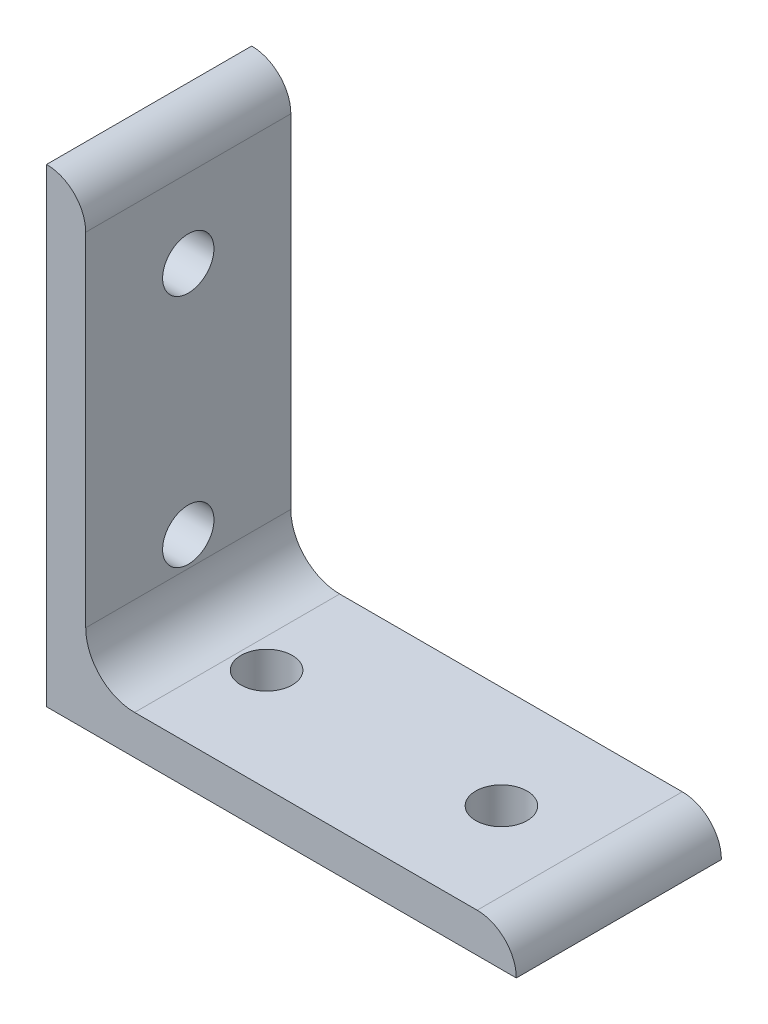
ISO-10303-21;
HEADER;
FILE_DESCRIPTION(('STEP AP214'),'2;1');
FILE_NAME('part.step','',(''),(''),'','','');
FILE_SCHEMA(('AUTOMOTIVE_DESIGN { 1 0 10303 214 1 1 1 1 }'));
ENDSEC;
DATA;
#1=APPLICATION_CONTEXT('core data for automotive mechanical design processes');
#2=APPLICATION_PROTOCOL_DEFINITION('international standard','automotive_design',2000,#1);
#3=PRODUCT_CONTEXT('',#1,'mechanical');
#4=PRODUCT('Part','Part','',(#3));
#5=PRODUCT_RELATED_PRODUCT_CATEGORY('part','',(#4));
#6=PRODUCT_DEFINITION_FORMATION('','',#4);
#7=PRODUCT_DEFINITION_CONTEXT('part definition',#1,'design');
#8=PRODUCT_DEFINITION('design','',#6,#7);
#9=PRODUCT_DEFINITION_SHAPE('','',#8);
#10=(LENGTH_UNIT() NAMED_UNIT(*) SI_UNIT(.MILLI.,.METRE.));
#11=(NAMED_UNIT(*) PLANE_ANGLE_UNIT() SI_UNIT($,.RADIAN.));
#12=(NAMED_UNIT(*) SI_UNIT($,.STERADIAN.) SOLID_ANGLE_UNIT());
#13=UNCERTAINTY_MEASURE_WITH_UNIT(LENGTH_MEASURE(1.E-05),#10,'distance_accuracy_value','');
#14=(GEOMETRIC_REPRESENTATION_CONTEXT(3) GLOBAL_UNCERTAINTY_ASSIGNED_CONTEXT((#13)) GLOBAL_UNIT_ASSIGNED_CONTEXT((#10,
#11,#12)) REPRESENTATION_CONTEXT('',''));
#15=CARTESIAN_POINT('',(0.,0.,0.));
#16=DIRECTION('',(0.,0.,1.));
#17=DIRECTION('',(1.,0.,0.));
#18=AXIS2_PLACEMENT_3D('',#15,#16,#17);
#19=CARTESIAN_POINT('',(6.35,69.85,16.637));
#20=DIRECTION('',(-1.,0.,0.));
#21=DIRECTION('',(0.,-1.,0.));
#22=AXIS2_PLACEMENT_3D('',#19,#20,#21);
#23=PLANE('',#22);
#24=DIRECTION('',(0.,1.,0.));
#25=VECTOR('',#24,1.);
#26=CARTESIAN_POINT('',(6.35,69.85,-16.637));
#27=LINE('',#26,#25);
#28=CARTESIAN_POINT('',(6.35,14.2748,-16.637));
#29=VERTEX_POINT('',#28);
#30=CARTESIAN_POINT('',(6.35,69.85,-16.637));
#31=VERTEX_POINT('',#30);
#32=EDGE_CURVE('E117',#29,#31,#27,.T.);
#33=ORIENTED_EDGE('',*,*,#32,.T.);
#34=DIRECTION('',(0.,0.,-1.));
#35=VECTOR('',#34,1.);
#36=CARTESIAN_POINT('',(6.35,69.85,16.637));
#37=LINE('',#36,#35);
#38=CARTESIAN_POINT('',(6.35,69.85,16.637));
#39=VERTEX_POINT('',#38);
#40=EDGE_CURVE('E114',#39,#31,#37,.T.);
#41=ORIENTED_EDGE('',*,*,#40,.F.);
#42=DIRECTION('',(0.,1.,0.));
#43=VECTOR('',#42,1.);
#44=CARTESIAN_POINT('',(6.35,69.85,16.637));
#45=LINE('',#44,#43);
#46=CARTESIAN_POINT('',(6.35,14.2748,16.637));
#47=VERTEX_POINT('',#46);
#48=EDGE_CURVE('E103',#47,#39,#45,.T.);
#49=ORIENTED_EDGE('',*,*,#48,.F.);
#50=DIRECTION('',(0.,0.,-1.));
#51=VECTOR('',#50,1.);
#52=CARTESIAN_POINT('',(6.35,14.2748,16.637));
#53=LINE('',#52,#51);
#54=EDGE_CURVE('E118',#47,#29,#53,.T.);
#55=ORIENTED_EDGE('',*,*,#54,.T.);
#56=EDGE_LOOP('',(#33,#41,#49,#55));
#57=FACE_BOUND('',#56,.T.);
#58=CARTESIAN_POINT('',(6.34999999999999,19.05,0.));
#59=DIRECTION('',(-1.,0.,0.));
#60=DIRECTION('',(0.,-1.,0.));
#61=AXIS2_PLACEMENT_3D('',#58,#59,#60);
#62=CIRCLE('',#61,4.1656);
#63=CARTESIAN_POINT('',(6.35,14.8844,0.));
#64=VERTEX_POINT('',#63);
#65=EDGE_CURVE('E196',#64,#64,#62,.F.);
#66=ORIENTED_EDGE('',*,*,#65,.F.);
#67=EDGE_LOOP('',(#66));
#68=FACE_BOUND('',#67,.T.);
#69=CARTESIAN_POINT('',(6.34999999999999,57.15,0.));
#70=DIRECTION('',(-1.,0.,0.));
#71=DIRECTION('',(0.,-1.,0.));
#72=AXIS2_PLACEMENT_3D('',#69,#70,#71);
#73=CIRCLE('',#72,4.1656);
#74=CARTESIAN_POINT('',(6.35,52.9844,0.));
#75=VERTEX_POINT('',#74);
#76=EDGE_CURVE('E191',#75,#75,#73,.F.);
#77=ORIENTED_EDGE('',*,*,#76,.F.);
#78=EDGE_LOOP('',(#77));
#79=FACE_BOUND('',#78,.T.);
#80=ADVANCED_FACE('F34',(#57,#68,#79),#23,.F.);
#81=CARTESIAN_POINT('',(0.,0.,16.637));
#82=DIRECTION('',(1.,0.,0.));
#83=DIRECTION('',(0.,0.,-1.));
#84=AXIS2_PLACEMENT_3D('',#81,#82,#83);
#85=PLANE('',#84);
#86=DIRECTION('',(0.,-1.,0.));
#87=VECTOR('',#86,1.);
#88=CARTESIAN_POINT('',(0.,0.,-16.637));
#89=LINE('',#88,#87);
#90=CARTESIAN_POINT('',(0.,76.2,-16.637));
#91=VERTEX_POINT('',#90);
#92=CARTESIAN_POINT('',(0.,0.,-16.637));
#93=VERTEX_POINT('',#92);
#94=EDGE_CURVE('E85',#91,#93,#89,.T.);
#95=ORIENTED_EDGE('',*,*,#94,.T.);
#96=DIRECTION('',(0.,0.,-1.));
#97=VECTOR('',#96,1.);
#98=CARTESIAN_POINT('',(0.,0.,16.637));
#99=LINE('',#98,#97);
#100=CARTESIAN_POINT('',(0.,0.,16.637));
#101=VERTEX_POINT('',#100);
#102=EDGE_CURVE('E123',#101,#93,#99,.T.);
#103=ORIENTED_EDGE('',*,*,#102,.F.);
#104=DIRECTION('',(0.,-1.,0.));
#105=VECTOR('',#104,1.);
#106=CARTESIAN_POINT('',(0.,0.,16.637));
#107=LINE('',#106,#105);
#108=CARTESIAN_POINT('',(0.,76.2,16.637));
#109=VERTEX_POINT('',#108);
#110=EDGE_CURVE('E53',#109,#101,#107,.T.);
#111=ORIENTED_EDGE('',*,*,#110,.F.);
#112=DIRECTION('',(0.,0.,-1.));
#113=VECTOR('',#112,1.);
#114=CARTESIAN_POINT('',(0.,76.2,16.637));
#115=LINE('',#114,#113);
#116=EDGE_CURVE('E119',#109,#91,#115,.T.);
#117=ORIENTED_EDGE('',*,*,#116,.T.);
#118=EDGE_LOOP('',(#95,#103,#111,#117));
#119=FACE_BOUND('',#118,.T.);
#120=CARTESIAN_POINT('',(0.,19.05,0.));
#121=DIRECTION('',(1.,0.,0.));
#122=DIRECTION('',(0.,0.,-1.));
#123=AXIS2_PLACEMENT_3D('',#120,#121,#122);
#124=CIRCLE('',#123,4.1656);
#125=CARTESIAN_POINT('',(0.,19.05,-4.1656));
#126=VERTEX_POINT('',#125);
#127=EDGE_CURVE('E186',#126,#126,#124,.T.);
#128=ORIENTED_EDGE('',*,*,#127,.T.);
#129=EDGE_LOOP('',(#128));
#130=FACE_BOUND('',#129,.T.);
#131=CARTESIAN_POINT('',(0.,57.15,0.));
#132=DIRECTION('',(1.,0.,0.));
#133=DIRECTION('',(0.,0.,-1.));
#134=AXIS2_PLACEMENT_3D('',#131,#132,#133);
#135=CIRCLE('',#134,4.1656);
#136=CARTESIAN_POINT('',(0.,57.15,-4.1656));
#137=VERTEX_POINT('',#136);
#138=EDGE_CURVE('E189',#137,#137,#135,.T.);
#139=ORIENTED_EDGE('',*,*,#138,.T.);
#140=EDGE_LOOP('',(#139));
#141=FACE_BOUND('',#140,.T.);
#142=ADVANCED_FACE('F179',(#119,#130,#141),#85,.F.);
#143=CARTESIAN_POINT('',(76.2,0.,16.637));
#144=DIRECTION('',(0.,1.,0.));
#145=DIRECTION('',(-1.,0.,0.));
#146=AXIS2_PLACEMENT_3D('',#143,#144,#145);
#147=PLANE('',#146);
#148=DIRECTION('',(1.,0.,0.));
#149=VECTOR('',#148,1.);
#150=CARTESIAN_POINT('',(76.2,0.,-16.637));
#151=LINE('',#150,#149);
#152=CARTESIAN_POINT('',(76.2,0.,-16.637));
#153=VERTEX_POINT('',#152);
#154=EDGE_CURVE('E127',#93,#153,#151,.T.);
#155=ORIENTED_EDGE('',*,*,#154,.T.);
#156=DIRECTION('',(0.,0.,-1.));
#157=VECTOR('',#156,1.);
#158=CARTESIAN_POINT('',(76.2,0.,16.637));
#159=LINE('',#158,#157);
#160=CARTESIAN_POINT('',(76.2,0.,16.637));
#161=VERTEX_POINT('',#160);
#162=EDGE_CURVE('E11',#161,#153,#159,.T.);
#163=ORIENTED_EDGE('',*,*,#162,.F.);
#164=DIRECTION('',(1.,0.,0.));
#165=VECTOR('',#164,1.);
#166=CARTESIAN_POINT('',(76.2,0.,16.637));
#167=LINE('',#166,#165);
#168=EDGE_CURVE('E140',#101,#161,#167,.T.);
#169=ORIENTED_EDGE('',*,*,#168,.F.);
#170=ORIENTED_EDGE('',*,*,#102,.T.);
#171=EDGE_LOOP('',(#155,#163,#169,#170));
#172=FACE_BOUND('',#171,.T.);
#173=CARTESIAN_POINT('',(19.05,0.,0.));
#174=DIRECTION('',(0.,1.,0.));
#175=DIRECTION('',(0.,0.,1.));
#176=AXIS2_PLACEMENT_3D('',#173,#174,#175);
#177=CIRCLE('',#176,4.1656);
#178=CARTESIAN_POINT('',(19.05,0.,-4.1656));
#179=VERTEX_POINT('',#178);
#180=EDGE_CURVE('E149',#179,#179,#177,.T.);
#181=ORIENTED_EDGE('',*,*,#180,.T.);
#182=EDGE_LOOP('',(#181));
#183=FACE_BOUND('',#182,.T.);
#184=CARTESIAN_POINT('',(57.15,0.,0.));
#185=DIRECTION('',(0.,1.,0.));
#186=DIRECTION('',(0.,0.,1.));
#187=AXIS2_PLACEMENT_3D('',#184,#185,#186);
#188=CIRCLE('',#187,4.1656);
#189=CARTESIAN_POINT('',(57.15,0.,-4.1656));
#190=VERTEX_POINT('',#189);
#191=EDGE_CURVE('E157',#190,#190,#188,.T.);
#192=ORIENTED_EDGE('',*,*,#191,.T.);
#193=EDGE_LOOP('',(#192));
#194=FACE_BOUND('',#193,.T.);
#195=ADVANCED_FACE('F36',(#172,#183,#194),#147,.F.);
#196=CARTESIAN_POINT('',(14.2748,6.35,16.637));
#197=DIRECTION('',(0.,-1.,0.));
#198=DIRECTION('',(1.,0.,0.));
#199=AXIS2_PLACEMENT_3D('',#196,#197,#198);
#200=PLANE('',#199);
#201=DIRECTION('',(-1.,0.,0.));
#202=VECTOR('',#201,1.);
#203=CARTESIAN_POINT('',(14.2748,6.35,-16.637));
#204=LINE('',#203,#202);
#205=CARTESIAN_POINT('',(69.85,6.35,-16.637));
#206=VERTEX_POINT('',#205);
#207=CARTESIAN_POINT('',(14.2748,6.35,-16.637));
#208=VERTEX_POINT('',#207);
#209=EDGE_CURVE('E133',#206,#208,#204,.T.);
#210=ORIENTED_EDGE('',*,*,#209,.T.);
#211=DIRECTION('',(0.,0.,-1.));
#212=VECTOR('',#211,1.);
#213=CARTESIAN_POINT('',(14.2748,6.35,16.637));
#214=LINE('',#213,#212);
#215=CARTESIAN_POINT('',(14.2748,6.35,16.637));
#216=VERTEX_POINT('',#215);
#217=EDGE_CURVE('E144',#216,#208,#214,.T.);
#218=ORIENTED_EDGE('',*,*,#217,.F.);
#219=DIRECTION('',(-1.,0.,0.));
#220=VECTOR('',#219,1.);
#221=CARTESIAN_POINT('',(14.2748,6.35,16.637));
#222=LINE('',#221,#220);
#223=CARTESIAN_POINT('',(69.85,6.35,16.637));
#224=VERTEX_POINT('',#223);
#225=EDGE_CURVE('E163',#224,#216,#222,.T.);
#226=ORIENTED_EDGE('',*,*,#225,.F.);
#227=DIRECTION('',(0.,0.,-1.));
#228=VECTOR('',#227,1.);
#229=CARTESIAN_POINT('',(69.85,6.35,16.637));
#230=LINE('',#229,#228);
#231=EDGE_CURVE('E44',#224,#206,#230,.T.);
#232=ORIENTED_EDGE('',*,*,#231,.T.);
#233=EDGE_LOOP('',(#210,#218,#226,#232));
#234=FACE_BOUND('',#233,.T.);
#235=CARTESIAN_POINT('',(19.05,6.35000000000001,0.));
#236=DIRECTION('',(0.,-1.,0.));
#237=DIRECTION('',(1.,0.,0.));
#238=AXIS2_PLACEMENT_3D('',#235,#236,#237);
#239=CIRCLE('',#238,4.1656);
#240=CARTESIAN_POINT('',(19.05,6.35000000000002,-4.1656));
#241=VERTEX_POINT('',#240);
#242=EDGE_CURVE('E131',#241,#241,#239,.F.);
#243=ORIENTED_EDGE('',*,*,#242,.F.);
#244=EDGE_LOOP('',(#243));
#245=FACE_BOUND('',#244,.T.);
#246=CARTESIAN_POINT('',(57.15,6.35000000000001,0.));
#247=DIRECTION('',(0.,-1.,0.));
#248=DIRECTION('',(1.,0.,0.));
#249=AXIS2_PLACEMENT_3D('',#246,#247,#248);
#250=CIRCLE('',#249,4.1656);
#251=CARTESIAN_POINT('',(57.15,6.35000000000002,-4.1656));
#252=VERTEX_POINT('',#251);
#253=EDGE_CURVE('E38',#252,#252,#250,.F.);
#254=ORIENTED_EDGE('',*,*,#253,.F.);
#255=EDGE_LOOP('',(#254));
#256=FACE_BOUND('',#255,.T.);
#257=ADVANCED_FACE('F167',(#234,#245,#256),#200,.F.);
#258=CARTESIAN_POINT('',(69.85,0.,16.637));
#259=DIRECTION('',(0.,0.,-1.));
#260=DIRECTION('',(-1.,0.,0.));
#261=AXIS2_PLACEMENT_3D('',#258,#259,#260);
#262=CYLINDRICAL_SURFACE('',#261,6.35000000000001);
#263=CARTESIAN_POINT('',(69.85,0.,-16.637));
#264=DIRECTION('',(0.,0.,1.));
#265=DIRECTION('',(1.,0.,0.));
#266=AXIS2_PLACEMENT_3D('',#263,#264,#265);
#267=CIRCLE('',#266,6.35000000000001);
#268=EDGE_CURVE('E130',#153,#206,#267,.T.);
#269=ORIENTED_EDGE('',*,*,#268,.T.);
#270=ORIENTED_EDGE('',*,*,#231,.F.);
#271=CARTESIAN_POINT('',(69.85,0.,16.637));
#272=DIRECTION('',(0.,0.,1.));
#273=DIRECTION('',(1.,0.,0.));
#274=AXIS2_PLACEMENT_3D('',#271,#272,#273);
#275=CIRCLE('',#274,6.35000000000001);
#276=EDGE_CURVE('E93',#161,#224,#275,.T.);
#277=ORIENTED_EDGE('',*,*,#276,.F.);
#278=ORIENTED_EDGE('',*,*,#162,.T.);
#279=EDGE_LOOP('',(#269,#270,#277,#278));
#280=FACE_BOUND('',#279,.T.);
#281=ADVANCED_FACE('F213',(#280),#262,.T.);
#282=CARTESIAN_POINT('',(14.2748,14.2748,16.637));
#283=DIRECTION('',(0.,0.,-1.));
#284=DIRECTION('',(-1.,0.,0.));
#285=AXIS2_PLACEMENT_3D('',#282,#283,#284);
#286=CYLINDRICAL_SURFACE('',#285,7.9248);
#287=CARTESIAN_POINT('',(14.2748,14.2748,-16.637));
#288=DIRECTION('',(0.,0.,-1.));
#289=DIRECTION('',(1.,0.,0.));
#290=AXIS2_PLACEMENT_3D('',#287,#288,#289);
#291=CIRCLE('',#290,7.9248);
#292=EDGE_CURVE('E135',#208,#29,#291,.T.);
#293=ORIENTED_EDGE('',*,*,#292,.T.);
#294=ORIENTED_EDGE('',*,*,#54,.F.);
#295=CARTESIAN_POINT('',(14.2748,14.2748,16.637));
#296=DIRECTION('',(0.,0.,-1.));
#297=DIRECTION('',(1.,0.,0.));
#298=AXIS2_PLACEMENT_3D('',#295,#296,#297);
#299=CIRCLE('',#298,7.9248);
#300=EDGE_CURVE('E109',#216,#47,#299,.T.);
#301=ORIENTED_EDGE('',*,*,#300,.F.);
#302=ORIENTED_EDGE('',*,*,#217,.T.);
#303=EDGE_LOOP('',(#293,#294,#301,#302));
#304=FACE_BOUND('',#303,.T.);
#305=ADVANCED_FACE('F172',(#304),#286,.F.);
#306=CARTESIAN_POINT('',(0.,69.85,16.637));
#307=DIRECTION('',(0.,0.,-1.));
#308=DIRECTION('',(-1.,0.,0.));
#309=AXIS2_PLACEMENT_3D('',#306,#307,#308);
#310=CYLINDRICAL_SURFACE('',#309,6.35000000000001);
#311=CARTESIAN_POINT('',(0.,69.85,-16.637));
#312=DIRECTION('',(0.,0.,1.));
#313=DIRECTION('',(1.,0.,0.));
#314=AXIS2_PLACEMENT_3D('',#311,#312,#313);
#315=CIRCLE('',#314,6.35000000000001);
#316=EDGE_CURVE('E79',#31,#91,#315,.T.);
#317=ORIENTED_EDGE('',*,*,#316,.T.);
#318=ORIENTED_EDGE('',*,*,#116,.F.);
#319=CARTESIAN_POINT('',(0.,69.85,16.637));
#320=DIRECTION('',(0.,0.,1.));
#321=DIRECTION('',(1.,0.,0.));
#322=AXIS2_PLACEMENT_3D('',#319,#320,#321);
#323=CIRCLE('',#322,6.35000000000001);
#324=EDGE_CURVE('E107',#39,#109,#323,.T.);
#325=ORIENTED_EDGE('',*,*,#324,.F.);
#326=ORIENTED_EDGE('',*,*,#40,.T.);
#327=EDGE_LOOP('',(#317,#318,#325,#326));
#328=FACE_BOUND('',#327,.T.);
#329=ADVANCED_FACE('F121',(#328),#310,.T.);
#330=CARTESIAN_POINT('',(0.,69.85,16.637));
#331=DIRECTION('',(0.,0.,1.));
#332=DIRECTION('',(1.,0.,0.));
#333=AXIS2_PLACEMENT_3D('',#330,#331,#332);
#334=PLANE('',#333);
#335=ORIENTED_EDGE('',*,*,#168,.T.);
#336=ORIENTED_EDGE('',*,*,#276,.T.);
#337=ORIENTED_EDGE('',*,*,#225,.T.);
#338=ORIENTED_EDGE('',*,*,#300,.T.);
#339=ORIENTED_EDGE('',*,*,#48,.T.);
#340=ORIENTED_EDGE('',*,*,#324,.T.);
#341=ORIENTED_EDGE('',*,*,#110,.T.);
#342=EDGE_LOOP('',(#335,#336,#337,#338,#339,#340,#341));
#343=FACE_BOUND('',#342,.T.);
#344=ADVANCED_FACE('F105',(#343),#334,.T.);
#345=CARTESIAN_POINT('',(0.,69.85,-16.637));
#346=DIRECTION('',(0.,0.,1.));
#347=DIRECTION('',(1.,0.,0.));
#348=AXIS2_PLACEMENT_3D('',#345,#346,#347);
#349=PLANE('',#348);
#350=ORIENTED_EDGE('',*,*,#154,.F.);
#351=ORIENTED_EDGE('',*,*,#94,.F.);
#352=ORIENTED_EDGE('',*,*,#316,.F.);
#353=ORIENTED_EDGE('',*,*,#32,.F.);
#354=ORIENTED_EDGE('',*,*,#292,.F.);
#355=ORIENTED_EDGE('',*,*,#209,.F.);
#356=ORIENTED_EDGE('',*,*,#268,.F.);
#357=EDGE_LOOP('',(#350,#351,#352,#353,#354,#355,#356));
#358=FACE_BOUND('',#357,.T.);
#359=ADVANCED_FACE('F175',(#358),#349,.F.);
#360=CARTESIAN_POINT('',(19.05,76.2,0.));
#361=DIRECTION('',(0.,-1.,0.));
#362=DIRECTION('',(0.,0.,-1.));
#363=AXIS2_PLACEMENT_3D('',#360,#361,#362);
#364=CYLINDRICAL_SURFACE('',#363,4.1656);
#365=CARTESIAN_POINT('',(19.05,0.,-4.1656));
#366=CARTESIAN_POINT('',(19.05,0.0661458333333318,-4.1656));
#367=CARTESIAN_POINT('',(19.05,0.132291666666664,-4.1656));
#368=CARTESIAN_POINT('',(19.05,0.264583333333332,-4.1656));
#369=CARTESIAN_POINT('',(19.05,0.330729166666668,-4.1656));
#370=CARTESIAN_POINT('',(19.05,0.463020833333337,-4.1656));
#371=CARTESIAN_POINT('',(19.05,0.529166666666669,-4.1656));
#372=CARTESIAN_POINT('',(19.05,0.661458333333337,-4.1656));
#373=CARTESIAN_POINT('',(19.05,0.727604166666673,-4.1656));
#374=CARTESIAN_POINT('',(19.05,0.859895833333342,-4.1656));
#375=CARTESIAN_POINT('',(19.05,0.926041666666673,-4.1656));
#376=CARTESIAN_POINT('',(19.05,1.05833333333334,-4.1656));
#377=CARTESIAN_POINT('',(19.05,1.12447916666667,-4.1656));
#378=CARTESIAN_POINT('',(19.05,1.25677083333334,-4.1656));
#379=CARTESIAN_POINT('',(19.05,1.32291666666667,-4.1656));
#380=CARTESIAN_POINT('',(19.05,1.45520833333334,-4.1656));
#381=CARTESIAN_POINT('',(19.05,1.52135416666667,-4.1656));
#382=CARTESIAN_POINT('',(19.05,1.65364583333334,-4.1656));
#383=CARTESIAN_POINT('',(19.05,1.71979166666667,-4.1656));
#384=CARTESIAN_POINT('',(19.05,1.85208333333334,-4.1656));
#385=CARTESIAN_POINT('',(19.05,1.91822916666667,-4.1656));
#386=CARTESIAN_POINT('',(19.05,2.05052083333334,-4.1656));
#387=CARTESIAN_POINT('',(19.05,2.11666666666667,-4.1656));
#388=CARTESIAN_POINT('',(19.05,2.24895833333334,-4.1656));
#389=CARTESIAN_POINT('',(19.05,2.31510416666667,-4.1656));
#390=CARTESIAN_POINT('',(19.05,2.44739583333334,-4.1656));
#391=CARTESIAN_POINT('',(19.05,2.51354166666667,-4.1656));
#392=CARTESIAN_POINT('',(19.05,2.64583333333334,-4.1656));
#393=CARTESIAN_POINT('',(19.05,2.71197916666667,-4.1656));
#394=CARTESIAN_POINT('',(19.05,2.84427083333334,-4.1656));
#395=CARTESIAN_POINT('',(19.05,2.91041666666668,-4.1656));
#396=CARTESIAN_POINT('',(19.05,3.04270833333335,-4.1656));
#397=CARTESIAN_POINT('',(19.05,3.10885416666668,-4.1656));
#398=CARTESIAN_POINT('',(19.05,3.24114583333334,-4.1656));
#399=CARTESIAN_POINT('',(19.05,3.30729166666667,-4.1656));
#400=CARTESIAN_POINT('',(19.05,3.43958333333334,-4.1656));
#401=CARTESIAN_POINT('',(19.05,3.50572916666668,-4.1656));
#402=CARTESIAN_POINT('',(19.05,3.63802083333335,-4.1656));
#403=CARTESIAN_POINT('',(19.05,3.70416666666668,-4.1656));
#404=CARTESIAN_POINT('',(19.05,3.83645833333335,-4.1656));
#405=CARTESIAN_POINT('',(19.05,3.90260416666668,-4.1656));
#406=CARTESIAN_POINT('',(19.05,4.03489583333335,-4.1656));
#407=CARTESIAN_POINT('',(19.05,4.10104166666668,-4.1656));
#408=CARTESIAN_POINT('',(19.05,4.23333333333335,-4.1656));
#409=CARTESIAN_POINT('',(19.05,4.29947916666668,-4.1656));
#410=CARTESIAN_POINT('',(19.05,4.43177083333335,-4.1656));
#411=CARTESIAN_POINT('',(19.05,4.49791666666668,-4.1656));
#412=CARTESIAN_POINT('',(19.05,4.63020833333335,-4.1656));
#413=CARTESIAN_POINT('',(19.05,4.69635416666668,-4.1656));
#414=CARTESIAN_POINT('',(19.05,4.82864583333335,-4.1656));
#415=CARTESIAN_POINT('',(19.05,4.89479166666668,-4.1656));
#416=CARTESIAN_POINT('',(19.05,5.02708333333335,-4.1656));
#417=CARTESIAN_POINT('',(19.05,5.09322916666668,-4.1656));
#418=CARTESIAN_POINT('',(19.05,5.22552083333335,-4.1656));
#419=CARTESIAN_POINT('',(19.05,5.29166666666668,-4.1656));
#420=CARTESIAN_POINT('',(19.05,5.42395833333335,-4.1656));
#421=CARTESIAN_POINT('',(19.05,5.49010416666668,-4.1656));
#422=CARTESIAN_POINT('',(19.05,5.62239583333335,-4.1656));
#423=CARTESIAN_POINT('',(19.05,5.68854166666669,-4.1656));
#424=CARTESIAN_POINT('',(19.05,5.82083333333335,-4.1656));
#425=CARTESIAN_POINT('',(19.05,5.88697916666669,-4.1656));
#426=CARTESIAN_POINT('',(19.05,6.01927083333335,-4.1656));
#427=CARTESIAN_POINT('',(19.05,6.08541666666669,-4.1656));
#428=CARTESIAN_POINT('',(19.05,6.21770833333336,-4.1656));
#429=CARTESIAN_POINT('',(19.05,6.28385416666669,-4.1656));
#430=CARTESIAN_POINT('',(19.05,6.35000000000002,-4.1656));
#431=B_SPLINE_CURVE_WITH_KNOTS('',3,(#365,#366,#367,#368,#369,#370,#371,#372,#373,#374,#375,
#376,#377,#378,#379,#380,#381,#382,#383,#384,#385,#386,#387,#388,#389,#390,#391,#392,#393,#394,
#395,#396,#397,#398,#399,#400,#401,#402,#403,#404,#405,#406,#407,#408,#409,#410,#411,#412,#413,
#414,#415,#416,#417,#418,#419,#420,#421,#422,#423,#424,#425,#426,#427,#428,#429,#430),
.UNSPECIFIED.,.F.,.F.,(4,2,2,2,2,2,2,2,2,2,2,2,2,2,2,2,2,2,2,2,2,2,2,2,2,2,2,2,2,2,2,2,4),(0.,
0.198437499999995,0.396875000000005,0.5953125,0.79375000000001,0.992187500000005,1.190625,
1.38906250000001,1.58750000000001,1.7859375,1.98437500000001,2.18281250000001,2.38125,
2.57968750000001,2.77812500000001,2.97656250000002,3.17500000000001,3.37343750000001,
3.57187500000002,3.77031250000001,3.96875000000002,4.16718750000002,4.36562500000001,
4.56406250000002,4.76250000000002,4.96093750000001,5.15937500000002,5.35781250000002,
5.55625000000001,5.75468750000002,5.95312500000002,6.15156250000003,6.35000000000002),.UNSPECIFIED.);
#432=EDGE_CURVE('BSEAM208',#179,#241,#431,.T.);
#433=ORIENTED_EDGE('',*,*,#180,.F.);
#434=ORIENTED_EDGE('',*,*,#242,.T.);
#435=ORIENTED_EDGE('',*,*,#432,.T.);
#436=ORIENTED_EDGE('',*,*,#432,.F.);
#437=EDGE_LOOP('',(#433,#435,#434,#436));
#438=FACE_BOUND('',#437,.T.);
#439=ADVANCED_FACE('F208',(#438),#364,.F.);
#440=CARTESIAN_POINT('',(57.15,76.2,0.));
#441=DIRECTION('',(0.,-1.,0.));
#442=DIRECTION('',(0.,0.,-1.));
#443=AXIS2_PLACEMENT_3D('',#440,#441,#442);
#444=CYLINDRICAL_SURFACE('',#443,4.1656);
#445=CARTESIAN_POINT('',(57.15,0.,-4.1656));
#446=CARTESIAN_POINT('',(57.15,0.0661458333333318,-4.1656));
#447=CARTESIAN_POINT('',(57.15,0.132291666666664,-4.1656));
#448=CARTESIAN_POINT('',(57.15,0.264583333333332,-4.1656));
#449=CARTESIAN_POINT('',(57.15,0.330729166666668,-4.1656));
#450=CARTESIAN_POINT('',(57.15,0.463020833333337,-4.1656));
#451=CARTESIAN_POINT('',(57.15,0.529166666666669,-4.1656));
#452=CARTESIAN_POINT('',(57.15,0.661458333333337,-4.1656));
#453=CARTESIAN_POINT('',(57.15,0.727604166666673,-4.1656));
#454=CARTESIAN_POINT('',(57.15,0.859895833333342,-4.1656));
#455=CARTESIAN_POINT('',(57.15,0.926041666666673,-4.1656));
#456=CARTESIAN_POINT('',(57.15,1.05833333333334,-4.1656));
#457=CARTESIAN_POINT('',(57.15,1.12447916666667,-4.1656));
#458=CARTESIAN_POINT('',(57.15,1.25677083333334,-4.1656));
#459=CARTESIAN_POINT('',(57.15,1.32291666666667,-4.1656));
#460=CARTESIAN_POINT('',(57.15,1.45520833333334,-4.1656));
#461=CARTESIAN_POINT('',(57.15,1.52135416666667,-4.1656));
#462=CARTESIAN_POINT('',(57.15,1.65364583333334,-4.1656));
#463=CARTESIAN_POINT('',(57.15,1.71979166666667,-4.1656));
#464=CARTESIAN_POINT('',(57.15,1.85208333333334,-4.1656));
#465=CARTESIAN_POINT('',(57.15,1.91822916666667,-4.1656));
#466=CARTESIAN_POINT('',(57.15,2.05052083333334,-4.1656));
#467=CARTESIAN_POINT('',(57.15,2.11666666666667,-4.1656));
#468=CARTESIAN_POINT('',(57.15,2.24895833333334,-4.1656));
#469=CARTESIAN_POINT('',(57.15,2.31510416666667,-4.1656));
#470=CARTESIAN_POINT('',(57.15,2.44739583333334,-4.1656));
#471=CARTESIAN_POINT('',(57.15,2.51354166666667,-4.1656));
#472=CARTESIAN_POINT('',(57.15,2.64583333333334,-4.1656));
#473=CARTESIAN_POINT('',(57.15,2.71197916666667,-4.1656));
#474=CARTESIAN_POINT('',(57.15,2.84427083333334,-4.1656));
#475=CARTESIAN_POINT('',(57.15,2.91041666666668,-4.1656));
#476=CARTESIAN_POINT('',(57.15,3.04270833333335,-4.1656));
#477=CARTESIAN_POINT('',(57.15,3.10885416666668,-4.1656));
#478=CARTESIAN_POINT('',(57.15,3.24114583333334,-4.1656));
#479=CARTESIAN_POINT('',(57.15,3.30729166666667,-4.1656));
#480=CARTESIAN_POINT('',(57.15,3.43958333333334,-4.1656));
#481=CARTESIAN_POINT('',(57.15,3.50572916666668,-4.1656));
#482=CARTESIAN_POINT('',(57.15,3.63802083333335,-4.1656));
#483=CARTESIAN_POINT('',(57.15,3.70416666666668,-4.1656));
#484=CARTESIAN_POINT('',(57.15,3.83645833333335,-4.1656));
#485=CARTESIAN_POINT('',(57.15,3.90260416666668,-4.1656));
#486=CARTESIAN_POINT('',(57.15,4.03489583333335,-4.1656));
#487=CARTESIAN_POINT('',(57.15,4.10104166666668,-4.1656));
#488=CARTESIAN_POINT('',(57.15,4.23333333333335,-4.1656));
#489=CARTESIAN_POINT('',(57.15,4.29947916666668,-4.1656));
#490=CARTESIAN_POINT('',(57.15,4.43177083333335,-4.1656));
#491=CARTESIAN_POINT('',(57.15,4.49791666666668,-4.1656));
#492=CARTESIAN_POINT('',(57.15,4.63020833333335,-4.1656));
#493=CARTESIAN_POINT('',(57.15,4.69635416666668,-4.1656));
#494=CARTESIAN_POINT('',(57.15,4.82864583333335,-4.1656));
#495=CARTESIAN_POINT('',(57.15,4.89479166666668,-4.1656));
#496=CARTESIAN_POINT('',(57.15,5.02708333333335,-4.1656));
#497=CARTESIAN_POINT('',(57.15,5.09322916666668,-4.1656));
#498=CARTESIAN_POINT('',(57.15,5.22552083333335,-4.1656));
#499=CARTESIAN_POINT('',(57.15,5.29166666666668,-4.1656));
#500=CARTESIAN_POINT('',(57.15,5.42395833333335,-4.1656));
#501=CARTESIAN_POINT('',(57.15,5.49010416666668,-4.1656));
#502=CARTESIAN_POINT('',(57.15,5.62239583333335,-4.1656));
#503=CARTESIAN_POINT('',(57.15,5.68854166666669,-4.1656));
#504=CARTESIAN_POINT('',(57.15,5.82083333333335,-4.1656));
#505=CARTESIAN_POINT('',(57.15,5.88697916666669,-4.1656));
#506=CARTESIAN_POINT('',(57.15,6.01927083333335,-4.1656));
#507=CARTESIAN_POINT('',(57.15,6.08541666666669,-4.1656));
#508=CARTESIAN_POINT('',(57.15,6.21770833333336,-4.1656));
#509=CARTESIAN_POINT('',(57.15,6.28385416666669,-4.1656));
#510=CARTESIAN_POINT('',(57.15,6.35000000000002,-4.1656));
#511=B_SPLINE_CURVE_WITH_KNOTS('',3,(#445,#446,#447,#448,#449,#450,#451,#452,#453,#454,#455,
#456,#457,#458,#459,#460,#461,#462,#463,#464,#465,#466,#467,#468,#469,#470,#471,#472,#473,#474,
#475,#476,#477,#478,#479,#480,#481,#482,#483,#484,#485,#486,#487,#488,#489,#490,#491,#492,#493,
#494,#495,#496,#497,#498,#499,#500,#501,#502,#503,#504,#505,#506,#507,#508,#509,#510),
.UNSPECIFIED.,.F.,.F.,(4,2,2,2,2,2,2,2,2,2,2,2,2,2,2,2,2,2,2,2,2,2,2,2,2,2,2,2,2,2,2,2,4),(0.,
0.198437499999995,0.396875000000005,0.5953125,0.79375000000001,0.992187500000005,1.190625,
1.38906250000001,1.58750000000001,1.7859375,1.98437500000001,2.18281250000001,2.38125,
2.57968750000001,2.77812500000001,2.97656250000002,3.17500000000001,3.37343750000001,
3.57187500000002,3.77031250000001,3.96875000000002,4.16718750000002,4.36562500000001,
4.56406250000002,4.76250000000002,4.96093750000001,5.15937500000002,5.35781250000002,
5.55625000000001,5.75468750000002,5.95312500000002,6.15156250000003,6.35000000000002),.UNSPECIFIED.);
#512=EDGE_CURVE('BSEAM204',#190,#252,#511,.T.);
#513=ORIENTED_EDGE('',*,*,#191,.F.);
#514=ORIENTED_EDGE('',*,*,#253,.T.);
#515=ORIENTED_EDGE('',*,*,#512,.T.);
#516=ORIENTED_EDGE('',*,*,#512,.F.);
#517=EDGE_LOOP('',(#513,#515,#514,#516));
#518=FACE_BOUND('',#517,.T.);
#519=ADVANCED_FACE('F204',(#518),#444,.F.);
#520=CARTESIAN_POINT('',(76.2,19.05,0.));
#521=DIRECTION('',(-1.,0.,0.));
#522=DIRECTION('',(0.,0.,1.));
#523=AXIS2_PLACEMENT_3D('',#520,#521,#522);
#524=CYLINDRICAL_SURFACE('',#523,4.1656);
#525=ORIENTED_EDGE('',*,*,#127,.F.);
#526=EDGE_LOOP('',(#525));
#527=FACE_BOUND('',#526,.T.);
#528=ORIENTED_EDGE('',*,*,#65,.T.);
#529=EDGE_LOOP('',(#528));
#530=FACE_BOUND('',#529,.T.);
#531=ADVANCED_FACE('F207',(#527,#530),#524,.F.);
#532=CARTESIAN_POINT('',(76.2,57.15,0.));
#533=DIRECTION('',(-1.,0.,0.));
#534=DIRECTION('',(0.,0.,1.));
#535=AXIS2_PLACEMENT_3D('',#532,#533,#534);
#536=CYLINDRICAL_SURFACE('',#535,4.1656);
#537=ORIENTED_EDGE('',*,*,#138,.F.);
#538=EDGE_LOOP('',(#537));
#539=FACE_BOUND('',#538,.T.);
#540=ORIENTED_EDGE('',*,*,#76,.T.);
#541=EDGE_LOOP('',(#540));
#542=FACE_BOUND('',#541,.T.);
#543=ADVANCED_FACE('F243',(#539,#542),#536,.F.);
#544=CLOSED_SHELL('',(#80,#142,#195,#257,#281,#305,#329,#344,#359,#439,#519,#531,#543));
#545=MANIFOLD_SOLID_BREP('B2',#544);
#546=ADVANCED_BREP_SHAPE_REPRESENTATION('',(#18,#545),#14);
#547=SHAPE_DEFINITION_REPRESENTATION(#9,#546);
ENDSEC;
END-ISO-10303-21;
